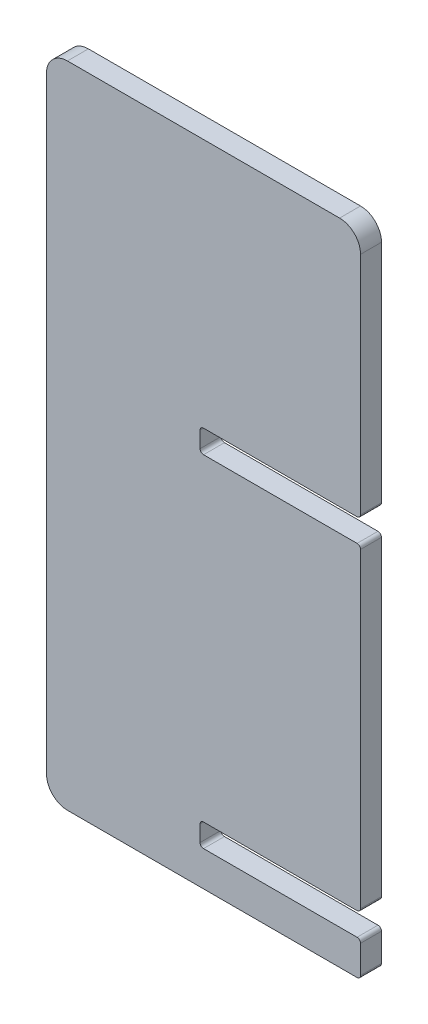
ISO-10303-21;
HEADER;
FILE_DESCRIPTION(('STEP AP214'),'2;1');
FILE_NAME('part.step','',(''),(''),'','','');
FILE_SCHEMA(('AUTOMOTIVE_DESIGN { 1 0 10303 214 1 1 1 1 }'));
ENDSEC;
DATA;
#1=APPLICATION_CONTEXT('core data for automotive mechanical design processes');
#2=APPLICATION_PROTOCOL_DEFINITION('international standard','automotive_design',2000,#1);
#3=PRODUCT_CONTEXT('',#1,'mechanical');
#4=PRODUCT('Part','Part','',(#3));
#5=PRODUCT_RELATED_PRODUCT_CATEGORY('part','',(#4));
#6=PRODUCT_DEFINITION_FORMATION('','',#4);
#7=PRODUCT_DEFINITION_CONTEXT('part definition',#1,'design');
#8=PRODUCT_DEFINITION('design','',#6,#7);
#9=PRODUCT_DEFINITION_SHAPE('','',#8);
#10=(LENGTH_UNIT() NAMED_UNIT(*) SI_UNIT(.MILLI.,.METRE.));
#11=(NAMED_UNIT(*) PLANE_ANGLE_UNIT() SI_UNIT($,.RADIAN.));
#12=(NAMED_UNIT(*) SI_UNIT($,.STERADIAN.) SOLID_ANGLE_UNIT());
#13=UNCERTAINTY_MEASURE_WITH_UNIT(LENGTH_MEASURE(1.E-05),#10,'distance_accuracy_value','');
#14=(GEOMETRIC_REPRESENTATION_CONTEXT(3) GLOBAL_UNCERTAINTY_ASSIGNED_CONTEXT((#13)) GLOBAL_UNIT_ASSIGNED_CONTEXT((#10,
#11,#12)) REPRESENTATION_CONTEXT('',''));
#15=CARTESIAN_POINT('',(0.,0.,0.));
#16=DIRECTION('',(0.,0.,1.));
#17=DIRECTION('',(1.,0.,0.));
#18=AXIS2_PLACEMENT_3D('',#15,#16,#17);
#19=CARTESIAN_POINT('',(22.5,45.,3.));
#20=DIRECTION('',(1.,0.,0.));
#21=DIRECTION('',(0.,1.,0.));
#22=AXIS2_PLACEMENT_3D('',#19,#20,#21);
#23=PLANE('',#22);
#24=DIRECTION('',(0.,-1.,0.));
#25=VECTOR('',#24,1.);
#26=CARTESIAN_POINT('',(22.5,45.,0.));
#27=LINE('',#26,#25);
#28=CARTESIAN_POINT('',(22.5,5.37945189583317,0.));
#29=VERTEX_POINT('',#28);
#30=CARTESIAN_POINT('',(22.5,-39.2,0.));
#31=VERTEX_POINT('',#30);
#32=EDGE_CURVE('E230',#29,#31,#27,.T.);
#33=ORIENTED_EDGE('',*,*,#32,.F.);
#34=DIRECTION('',(0.,0.,1.));
#35=VECTOR('',#34,1.);
#36=CARTESIAN_POINT('',(22.5,5.37945189583315,3.));
#37=LINE('',#36,#35);
#38=CARTESIAN_POINT('',(22.5,5.37945189583317,3.));
#39=VERTEX_POINT('',#38);
#40=EDGE_CURVE('E281',#29,#39,#37,.T.);
#41=ORIENTED_EDGE('',*,*,#40,.T.);
#42=DIRECTION('',(0.,-1.,0.));
#43=VECTOR('',#42,1.);
#44=CARTESIAN_POINT('',(22.5,45.,3.));
#45=LINE('',#44,#43);
#46=CARTESIAN_POINT('',(22.5,-39.2,3.));
#47=VERTEX_POINT('',#46);
#48=EDGE_CURVE('E382',#39,#47,#45,.T.);
#49=ORIENTED_EDGE('',*,*,#48,.T.);
#50=DIRECTION('',(0.,0.,1.));
#51=VECTOR('',#50,1.);
#52=CARTESIAN_POINT('',(22.5,-39.2,0.));
#53=LINE('',#52,#51);
#54=EDGE_CURVE('E279',#47,#31,#53,.F.);
#55=ORIENTED_EDGE('',*,*,#54,.T.);
#56=EDGE_LOOP('',(#33,#41,#49,#55));
#57=FACE_BOUND('',#56,.T.);
#58=ADVANCED_FACE('F37',(#57),#23,.T.);
#59=CARTESIAN_POINT('',(22.5,42.,3.));
#60=VERTEX_POINT('',#59);
#61=CARTESIAN_POINT('',(22.5,9.67945189583316,3.));
#62=VERTEX_POINT('',#61);
#63=EDGE_CURVE('E380',#60,#62,#45,.T.);
#64=ORIENTED_EDGE('',*,*,#63,.T.);
#65=DIRECTION('',(0.,0.,1.));
#66=VECTOR('',#65,1.);
#67=CARTESIAN_POINT('',(22.5,9.67945189583315,0.));
#68=LINE('',#67,#66);
#69=CARTESIAN_POINT('',(22.5,9.67945189583316,0.));
#70=VERTEX_POINT('',#69);
#71=EDGE_CURVE('E294',#62,#70,#68,.F.);
#72=ORIENTED_EDGE('',*,*,#71,.T.);
#73=CARTESIAN_POINT('',(22.5,42.,0.));
#74=VERTEX_POINT('',#73);
#75=EDGE_CURVE('E225',#74,#70,#27,.T.);
#76=ORIENTED_EDGE('',*,*,#75,.F.);
#77=DIRECTION('',(0.,0.,-1.));
#78=VECTOR('',#77,1.);
#79=CARTESIAN_POINT('',(22.5,42.,3.));
#80=LINE('',#79,#78);
#81=EDGE_CURVE('E251',#74,#60,#80,.F.);
#82=ORIENTED_EDGE('',*,*,#81,.T.);
#83=EDGE_LOOP('',(#64,#72,#76,#82));
#84=FACE_BOUND('',#83,.T.);
#85=ADVANCED_FACE('F426',(#84),#23,.T.);
#86=CARTESIAN_POINT('',(-22.5,45.,3.));
#87=DIRECTION('',(0.,1.,0.));
#88=DIRECTION('',(0.,0.,1.));
#89=AXIS2_PLACEMENT_3D('',#86,#87,#88);
#90=PLANE('',#89);
#91=DIRECTION('',(1.,0.,0.));
#92=VECTOR('',#91,1.);
#93=CARTESIAN_POINT('',(-22.5,45.,3.));
#94=LINE('',#93,#92);
#95=CARTESIAN_POINT('',(-19.5,45.,3.));
#96=VERTEX_POINT('',#95);
#97=CARTESIAN_POINT('',(19.5,45.,3.));
#98=VERTEX_POINT('',#97);
#99=EDGE_CURVE('E227',#96,#98,#94,.T.);
#100=ORIENTED_EDGE('',*,*,#99,.T.);
#101=DIRECTION('',(0.,0.,-1.));
#102=VECTOR('',#101,1.);
#103=CARTESIAN_POINT('',(19.5,45.,3.));
#104=LINE('',#103,#102);
#105=CARTESIAN_POINT('',(19.5,45.,0.));
#106=VERTEX_POINT('',#105);
#107=EDGE_CURVE('E248',#98,#106,#104,.T.);
#108=ORIENTED_EDGE('',*,*,#107,.T.);
#109=DIRECTION('',(1.,0.,0.));
#110=VECTOR('',#109,1.);
#111=CARTESIAN_POINT('',(-22.5,45.,0.));
#112=LINE('',#111,#110);
#113=CARTESIAN_POINT('',(-19.5,45.,0.));
#114=VERTEX_POINT('',#113);
#115=EDGE_CURVE('E374',#114,#106,#112,.T.);
#116=ORIENTED_EDGE('',*,*,#115,.F.);
#117=DIRECTION('',(0.,0.,-1.));
#118=VECTOR('',#117,1.);
#119=CARTESIAN_POINT('',(-19.5,45.,3.));
#120=LINE('',#119,#118);
#121=EDGE_CURVE('E246',#114,#96,#120,.F.);
#122=ORIENTED_EDGE('',*,*,#121,.T.);
#123=EDGE_LOOP('',(#100,#108,#116,#122));
#124=FACE_BOUND('',#123,.T.);
#125=ADVANCED_FACE('F417',(#124),#90,.T.);
#126=CARTESIAN_POINT('',(-22.5,45.,3.));
#127=DIRECTION('',(1.,0.,0.));
#128=DIRECTION('',(0.,1.,0.));
#129=AXIS2_PLACEMENT_3D('',#126,#127,#128);
#130=PLANE('',#129);
#131=DIRECTION('',(0.,-1.,0.));
#132=VECTOR('',#131,1.);
#133=CARTESIAN_POINT('',(-22.5,45.,0.));
#134=LINE('',#133,#132);
#135=CARTESIAN_POINT('',(-22.5,42.,0.));
#136=VERTEX_POINT('',#135);
#137=CARTESIAN_POINT('',(-22.5,-45.,0.));
#138=VERTEX_POINT('',#137);
#139=EDGE_CURVE('E224',#136,#138,#134,.T.);
#140=ORIENTED_EDGE('',*,*,#139,.T.);
#141=DIRECTION('',(0.,0.,-1.));
#142=VECTOR('',#141,1.);
#143=CARTESIAN_POINT('',(-22.5,-45.,3.));
#144=LINE('',#143,#142);
#145=CARTESIAN_POINT('',(-22.5,-45.,3.));
#146=VERTEX_POINT('',#145);
#147=EDGE_CURVE('E202',#138,#146,#144,.F.);
#148=ORIENTED_EDGE('',*,*,#147,.T.);
#149=DIRECTION('',(0.,-1.,0.));
#150=VECTOR('',#149,1.);
#151=CARTESIAN_POINT('',(-22.5,45.,3.));
#152=LINE('',#151,#150);
#153=CARTESIAN_POINT('',(-22.5,42.,3.));
#154=VERTEX_POINT('',#153);
#155=EDGE_CURVE('E219',#154,#146,#152,.T.);
#156=ORIENTED_EDGE('',*,*,#155,.F.);
#157=DIRECTION('',(0.,0.,-1.));
#158=VECTOR('',#157,1.);
#159=CARTESIAN_POINT('',(-22.5,42.,0.));
#160=LINE('',#159,#158);
#161=EDGE_CURVE('E207',#154,#136,#160,.T.);
#162=ORIENTED_EDGE('',*,*,#161,.T.);
#163=EDGE_LOOP('',(#140,#148,#156,#162));
#164=FACE_BOUND('',#163,.T.);
#165=ADVANCED_FACE('F412',(#164),#130,.F.);
#166=CARTESIAN_POINT('',(-22.5,-48.,3.));
#167=DIRECTION('',(0.,1.,0.));
#168=DIRECTION('',(0.,0.,1.));
#169=AXIS2_PLACEMENT_3D('',#166,#167,#168);
#170=PLANE('',#169);
#171=DIRECTION('',(1.,0.,0.));
#172=VECTOR('',#171,1.);
#173=CARTESIAN_POINT('',(-22.5,-48.,0.));
#174=LINE('',#173,#172);
#175=CARTESIAN_POINT('',(-19.5,-48.,0.));
#176=VERTEX_POINT('',#175);
#177=CARTESIAN_POINT('',(22.,-48.,0.));
#178=VERTEX_POINT('',#177);
#179=EDGE_CURVE('E214',#176,#178,#174,.T.);
#180=ORIENTED_EDGE('',*,*,#179,.T.);
#181=DIRECTION('',(0.,0.,-1.));
#182=VECTOR('',#181,1.);
#183=CARTESIAN_POINT('',(22.,-48.,3.));
#184=LINE('',#183,#182);
#185=CARTESIAN_POINT('',(22.,-48.,3.));
#186=VERTEX_POINT('',#185);
#187=EDGE_CURVE('E268',#178,#186,#184,.F.);
#188=ORIENTED_EDGE('',*,*,#187,.T.);
#189=DIRECTION('',(1.,0.,0.));
#190=VECTOR('',#189,1.);
#191=CARTESIAN_POINT('',(-22.5,-48.,3.));
#192=LINE('',#191,#190);
#193=CARTESIAN_POINT('',(-19.5,-48.,3.));
#194=VERTEX_POINT('',#193);
#195=EDGE_CURVE('E217',#194,#186,#192,.T.);
#196=ORIENTED_EDGE('',*,*,#195,.F.);
#197=DIRECTION('',(0.,0.,-1.));
#198=VECTOR('',#197,1.);
#199=CARTESIAN_POINT('',(-19.5,-48.,3.));
#200=LINE('',#199,#198);
#201=EDGE_CURVE('E201',#194,#176,#200,.T.);
#202=ORIENTED_EDGE('',*,*,#201,.T.);
#203=EDGE_LOOP('',(#180,#188,#196,#202));
#204=FACE_BOUND('',#203,.T.);
#205=ADVANCED_FACE('F213',(#204),#170,.F.);
#206=CARTESIAN_POINT('',(22.5,-43.5,3.));
#207=VERTEX_POINT('',#206);
#208=CARTESIAN_POINT('',(22.5,-47.5,3.));
#209=VERTEX_POINT('',#208);
#210=EDGE_CURVE('E379',#207,#209,#45,.T.);
#211=ORIENTED_EDGE('',*,*,#210,.T.);
#212=DIRECTION('',(0.,0.,-1.));
#213=VECTOR('',#212,1.);
#214=CARTESIAN_POINT('',(22.5,-47.5,0.));
#215=LINE('',#214,#213);
#216=CARTESIAN_POINT('',(22.5,-47.5,0.));
#217=VERTEX_POINT('',#216);
#218=EDGE_CURVE('E256',#209,#217,#215,.T.);
#219=ORIENTED_EDGE('',*,*,#218,.T.);
#220=CARTESIAN_POINT('',(22.5,-43.5,0.));
#221=VERTEX_POINT('',#220);
#222=EDGE_CURVE('E232',#221,#217,#27,.T.);
#223=ORIENTED_EDGE('',*,*,#222,.F.);
#224=DIRECTION('',(0.,0.,1.));
#225=VECTOR('',#224,1.);
#226=CARTESIAN_POINT('',(22.5,-43.5,3.));
#227=LINE('',#226,#225);
#228=EDGE_CURVE('E253',#221,#207,#227,.T.);
#229=ORIENTED_EDGE('',*,*,#228,.T.);
#230=EDGE_LOOP('',(#211,#219,#223,#229));
#231=FACE_BOUND('',#230,.T.);
#232=ADVANCED_FACE('F402',(#231),#23,.T.);
#233=CARTESIAN_POINT('',(0.,0.,3.));
#234=DIRECTION('',(0.,0.,-1.));
#235=DIRECTION('',(-1.,0.,0.));
#236=AXIS2_PLACEMENT_3D('',#233,#234,#235);
#237=PLANE('',#236);
#238=ORIENTED_EDGE('',*,*,#195,.T.);
#239=CARTESIAN_POINT('',(22.,-47.5,3.));
#240=DIRECTION('',(0.,0.,-1.));
#241=DIRECTION('',(-1.,0.,0.));
#242=AXIS2_PLACEMENT_3D('',#239,#240,#241);
#243=CIRCLE('',#242,0.5);
#244=EDGE_CURVE('E277',#186,#209,#243,.F.);
#245=ORIENTED_EDGE('',*,*,#244,.T.);
#246=ORIENTED_EDGE('',*,*,#210,.F.);
#247=CARTESIAN_POINT('',(22.,-43.5,3.));
#248=DIRECTION('',(0.,0.,-1.));
#249=DIRECTION('',(-1.,0.,0.));
#250=AXIS2_PLACEMENT_3D('',#247,#248,#249);
#251=CIRCLE('',#250,0.5);
#252=CARTESIAN_POINT('',(22.,-43.,3.));
#253=VERTEX_POINT('',#252);
#254=EDGE_CURVE('E272',#207,#253,#251,.F.);
#255=ORIENTED_EDGE('',*,*,#254,.T.);
#256=DIRECTION('',(1.,0.,0.));
#257=VECTOR('',#256,1.);
#258=CARTESIAN_POINT('',(22.5,-43.,3.));
#259=LINE('',#258,#257);
#260=CARTESIAN_POINT('',(0.,-43.,3.));
#261=VERTEX_POINT('',#260);
#262=EDGE_CURVE('E357',#261,#253,#259,.T.);
#263=ORIENTED_EDGE('',*,*,#262,.F.);
#264=CARTESIAN_POINT('',(0.,-42.5,3.));
#265=DIRECTION('',(0.,0.,-1.));
#266=DIRECTION('',(-1.,0.,0.));
#267=AXIS2_PLACEMENT_3D('',#264,#265,#266);
#268=CIRCLE('',#267,0.5);
#269=CARTESIAN_POINT('',(-0.500000000000004,-42.5,3.));
#270=VERTEX_POINT('',#269);
#271=EDGE_CURVE('E323',#261,#270,#268,.T.);
#272=ORIENTED_EDGE('',*,*,#271,.T.);
#273=DIRECTION('',(0.,-1.,0.));
#274=VECTOR('',#273,1.);
#275=CARTESIAN_POINT('',(-0.500000000000004,-39.7,3.));
#276=LINE('',#275,#274);
#277=CARTESIAN_POINT('',(-0.500000000000004,-40.2,3.));
#278=VERTEX_POINT('',#277);
#279=EDGE_CURVE('E332',#278,#270,#276,.T.);
#280=ORIENTED_EDGE('',*,*,#279,.F.);
#281=CARTESIAN_POINT('',(0.,-40.2,3.));
#282=DIRECTION('',(0.,0.,-1.));
#283=DIRECTION('',(-1.,0.,0.));
#284=AXIS2_PLACEMENT_3D('',#281,#282,#283);
#285=CIRCLE('',#284,0.5);
#286=CARTESIAN_POINT('',(0.,-39.7,3.));
#287=VERTEX_POINT('',#286);
#288=EDGE_CURVE('E45',#278,#287,#285,.T.);
#289=ORIENTED_EDGE('',*,*,#288,.T.);
#290=DIRECTION('',(-1.,0.,0.));
#291=VECTOR('',#290,1.);
#292=CARTESIAN_POINT('',(22.5,-39.7,3.));
#293=LINE('',#292,#291);
#294=CARTESIAN_POINT('',(22.,-39.7,3.));
#295=VERTEX_POINT('',#294);
#296=EDGE_CURVE('E330',#295,#287,#293,.T.);
#297=ORIENTED_EDGE('',*,*,#296,.F.);
#298=CARTESIAN_POINT('',(22.,-39.2,3.));
#299=DIRECTION('',(0.,0.,-1.));
#300=DIRECTION('',(-1.,0.,0.));
#301=AXIS2_PLACEMENT_3D('',#298,#299,#300);
#302=CIRCLE('',#301,0.5);
#303=EDGE_CURVE('E270',#295,#47,#302,.F.);
#304=ORIENTED_EDGE('',*,*,#303,.T.);
#305=ORIENTED_EDGE('',*,*,#48,.F.);
#306=CARTESIAN_POINT('',(22.,5.37945189583315,3.));
#307=DIRECTION('',(0.,0.,-1.));
#308=DIRECTION('',(-1.,0.,0.));
#309=AXIS2_PLACEMENT_3D('',#306,#307,#308);
#310=CIRCLE('',#309,0.5);
#311=CARTESIAN_POINT('',(22.,5.87945189583315,3.));
#312=VERTEX_POINT('',#311);
#313=EDGE_CURVE('E275',#39,#312,#310,.F.);
#314=ORIENTED_EDGE('',*,*,#313,.T.);
#315=DIRECTION('',(1.,0.,0.));
#316=VECTOR('',#315,1.);
#317=CARTESIAN_POINT('',(22.5,5.87945189583315,3.));
#318=LINE('',#317,#316);
#319=CARTESIAN_POINT('',(0.,5.87945189583315,3.));
#320=VERTEX_POINT('',#319);
#321=EDGE_CURVE('E360',#320,#312,#318,.T.);
#322=ORIENTED_EDGE('',*,*,#321,.F.);
#323=CARTESIAN_POINT('',(0.,6.37945189583315,3.));
#324=DIRECTION('',(0.,0.,-1.));
#325=DIRECTION('',(-1.,0.,0.));
#326=AXIS2_PLACEMENT_3D('',#323,#324,#325);
#327=CIRCLE('',#326,0.5);
#328=CARTESIAN_POINT('',(-0.500000000000004,6.37945189583315,3.));
#329=VERTEX_POINT('',#328);
#330=EDGE_CURVE('E319',#320,#329,#327,.T.);
#331=ORIENTED_EDGE('',*,*,#330,.T.);
#332=DIRECTION('',(0.,-1.,0.));
#333=VECTOR('',#332,1.);
#334=CARTESIAN_POINT('',(-0.500000000000004,9.17945189583315,3.));
#335=LINE('',#334,#333);
#336=CARTESIAN_POINT('',(-0.500000000000004,8.67945189583315,3.));
#337=VERTEX_POINT('',#336);
#338=EDGE_CURVE('E364',#337,#329,#335,.T.);
#339=ORIENTED_EDGE('',*,*,#338,.F.);
#340=CARTESIAN_POINT('',(0.,8.67945189583315,3.));
#341=DIRECTION('',(0.,0.,-1.));
#342=DIRECTION('',(-1.,0.,0.));
#343=AXIS2_PLACEMENT_3D('',#340,#341,#342);
#344=CIRCLE('',#343,0.5);
#345=CARTESIAN_POINT('',(0.,9.17945189583315,3.));
#346=VERTEX_POINT('',#345);
#347=EDGE_CURVE('E58',#337,#346,#344,.T.);
#348=ORIENTED_EDGE('',*,*,#347,.T.);
#349=DIRECTION('',(-1.,0.,0.));
#350=VECTOR('',#349,1.);
#351=CARTESIAN_POINT('',(22.5,9.17945189583315,3.));
#352=LINE('',#351,#350);
#353=CARTESIAN_POINT('',(22.,9.17945189583315,3.));
#354=VERTEX_POINT('',#353);
#355=EDGE_CURVE('E355',#354,#346,#352,.T.);
#356=ORIENTED_EDGE('',*,*,#355,.F.);
#357=CARTESIAN_POINT('',(22.,9.67945189583315,3.));
#358=DIRECTION('',(0.,0.,-1.));
#359=DIRECTION('',(-1.,0.,0.));
#360=AXIS2_PLACEMENT_3D('',#357,#358,#359);
#361=CIRCLE('',#360,0.5);
#362=EDGE_CURVE('E52',#354,#62,#361,.F.);
#363=ORIENTED_EDGE('',*,*,#362,.T.);
#364=ORIENTED_EDGE('',*,*,#63,.F.);
#365=CARTESIAN_POINT('',(19.5,42.,3.));
#366=DIRECTION('',(0.,0.,-1.));
#367=DIRECTION('',(-1.,0.,0.));
#368=AXIS2_PLACEMENT_3D('',#365,#366,#367);
#369=CIRCLE('',#368,3.);
#370=EDGE_CURVE('E242',#60,#98,#369,.F.);
#371=ORIENTED_EDGE('',*,*,#370,.T.);
#372=ORIENTED_EDGE('',*,*,#99,.F.);
#373=CARTESIAN_POINT('',(-19.5,42.,3.));
#374=DIRECTION('',(0.,0.,-1.));
#375=DIRECTION('',(-1.,0.,0.));
#376=AXIS2_PLACEMENT_3D('',#373,#374,#375);
#377=CIRCLE('',#376,3.);
#378=EDGE_CURVE('E240',#96,#154,#377,.F.);
#379=ORIENTED_EDGE('',*,*,#378,.T.);
#380=ORIENTED_EDGE('',*,*,#155,.T.);
#381=CARTESIAN_POINT('',(-19.5,-45.,3.));
#382=DIRECTION('',(0.,0.,-1.));
#383=DIRECTION('',(-1.,0.,0.));
#384=AXIS2_PLACEMENT_3D('',#381,#382,#383);
#385=CIRCLE('',#384,3.);
#386=EDGE_CURVE('E244',#146,#194,#385,.F.);
#387=ORIENTED_EDGE('',*,*,#386,.T.);
#388=EDGE_LOOP('',(#238,#245,#246,#255,#263,#272,#280,#289,#297,#304,#305,#314,#322,#331,#339,
#348,#356,#363,#364,#371,#372,#379,#380,#387));
#389=FACE_BOUND('',#388,.T.);
#390=ADVANCED_FACE('F329',(#389),#237,.F.);
#391=CARTESIAN_POINT('',(0.,0.,0.));
#392=DIRECTION('',(0.,0.,-1.));
#393=DIRECTION('',(-1.,0.,0.));
#394=AXIS2_PLACEMENT_3D('',#391,#392,#393);
#395=PLANE('',#394);
#396=ORIENTED_EDGE('',*,*,#222,.T.);
#397=CARTESIAN_POINT('',(22.,-47.5,0.));
#398=DIRECTION('',(0.,0.,-1.));
#399=DIRECTION('',(-1.,0.,0.));
#400=AXIS2_PLACEMENT_3D('',#397,#398,#399);
#401=CIRCLE('',#400,0.5);
#402=EDGE_CURVE('E223',#217,#178,#401,.T.);
#403=ORIENTED_EDGE('',*,*,#402,.T.);
#404=ORIENTED_EDGE('',*,*,#179,.F.);
#405=CARTESIAN_POINT('',(-19.5,-45.,0.));
#406=DIRECTION('',(0.,0.,-1.));
#407=DIRECTION('',(-1.,0.,0.));
#408=AXIS2_PLACEMENT_3D('',#405,#406,#407);
#409=CIRCLE('',#408,3.);
#410=EDGE_CURVE('E197',#176,#138,#409,.T.);
#411=ORIENTED_EDGE('',*,*,#410,.T.);
#412=ORIENTED_EDGE('',*,*,#139,.F.);
#413=CARTESIAN_POINT('',(-19.5,42.,0.));
#414=DIRECTION('',(0.,0.,-1.));
#415=DIRECTION('',(-1.,0.,0.));
#416=AXIS2_PLACEMENT_3D('',#413,#414,#415);
#417=CIRCLE('',#416,3.);
#418=EDGE_CURVE('E218',#136,#114,#417,.T.);
#419=ORIENTED_EDGE('',*,*,#418,.T.);
#420=ORIENTED_EDGE('',*,*,#115,.T.);
#421=CARTESIAN_POINT('',(19.5,42.,0.));
#422=DIRECTION('',(0.,0.,-1.));
#423=DIRECTION('',(-1.,0.,0.));
#424=AXIS2_PLACEMENT_3D('',#421,#422,#423);
#425=CIRCLE('',#424,3.);
#426=EDGE_CURVE('E208',#106,#74,#425,.T.);
#427=ORIENTED_EDGE('',*,*,#426,.T.);
#428=ORIENTED_EDGE('',*,*,#75,.T.);
#429=CARTESIAN_POINT('',(22.,9.67945189583315,0.));
#430=DIRECTION('',(0.,0.,-1.));
#431=DIRECTION('',(-1.,0.,0.));
#432=AXIS2_PLACEMENT_3D('',#429,#430,#431);
#433=CIRCLE('',#432,0.5);
#434=CARTESIAN_POINT('',(22.,9.17945189583315,0.));
#435=VERTEX_POINT('',#434);
#436=EDGE_CURVE('E263',#70,#435,#433,.T.);
#437=ORIENTED_EDGE('',*,*,#436,.T.);
#438=DIRECTION('',(-1.,0.,0.));
#439=VECTOR('',#438,1.);
#440=CARTESIAN_POINT('',(22.5,9.17945189583315,0.));
#441=LINE('',#440,#439);
#442=CARTESIAN_POINT('',(0.,9.17945189583315,0.));
#443=VERTEX_POINT('',#442);
#444=EDGE_CURVE('E363',#435,#443,#441,.T.);
#445=ORIENTED_EDGE('',*,*,#444,.T.);
#446=CARTESIAN_POINT('',(0.,8.67945189583315,0.));
#447=DIRECTION('',(0.,0.,-1.));
#448=DIRECTION('',(-1.,0.,0.));
#449=AXIS2_PLACEMENT_3D('',#446,#447,#448);
#450=CIRCLE('',#449,0.5);
#451=CARTESIAN_POINT('',(-0.500000000000004,8.67945189583315,0.));
#452=VERTEX_POINT('',#451);
#453=EDGE_CURVE('E317',#443,#452,#450,.F.);
#454=ORIENTED_EDGE('',*,*,#453,.T.);
#455=DIRECTION('',(0.,-1.,0.));
#456=VECTOR('',#455,1.);
#457=CARTESIAN_POINT('',(-0.500000000000004,9.17945189583315,0.));
#458=LINE('',#457,#456);
#459=CARTESIAN_POINT('',(-0.500000000000004,6.37945189583315,0.));
#460=VERTEX_POINT('',#459);
#461=EDGE_CURVE('E370',#452,#460,#458,.T.);
#462=ORIENTED_EDGE('',*,*,#461,.T.);
#463=CARTESIAN_POINT('',(0.,6.37945189583315,0.));
#464=DIRECTION('',(0.,0.,-1.));
#465=DIRECTION('',(-1.,0.,0.));
#466=AXIS2_PLACEMENT_3D('',#463,#464,#465);
#467=CIRCLE('',#466,0.5);
#468=CARTESIAN_POINT('',(0.,5.87945189583315,0.));
#469=VERTEX_POINT('',#468);
#470=EDGE_CURVE('E321',#460,#469,#467,.F.);
#471=ORIENTED_EDGE('',*,*,#470,.T.);
#472=DIRECTION('',(1.,0.,0.));
#473=VECTOR('',#472,1.);
#474=CARTESIAN_POINT('',(22.5,5.87945189583315,0.));
#475=LINE('',#474,#473);
#476=CARTESIAN_POINT('',(22.,5.87945189583315,0.));
#477=VERTEX_POINT('',#476);
#478=EDGE_CURVE('E371',#469,#477,#475,.T.);
#479=ORIENTED_EDGE('',*,*,#478,.T.);
#480=CARTESIAN_POINT('',(22.,5.37945189583315,0.));
#481=DIRECTION('',(0.,0.,-1.));
#482=DIRECTION('',(-1.,0.,0.));
#483=AXIS2_PLACEMENT_3D('',#480,#481,#482);
#484=CIRCLE('',#483,0.5);
#485=EDGE_CURVE('E265',#477,#29,#484,.T.);
#486=ORIENTED_EDGE('',*,*,#485,.T.);
#487=ORIENTED_EDGE('',*,*,#32,.T.);
#488=CARTESIAN_POINT('',(22.,-39.2,0.));
#489=DIRECTION('',(0.,0.,-1.));
#490=DIRECTION('',(-1.,0.,0.));
#491=AXIS2_PLACEMENT_3D('',#488,#489,#490);
#492=CIRCLE('',#491,0.5);
#493=CARTESIAN_POINT('',(22.,-39.7,0.));
#494=VERTEX_POINT('',#493);
#495=EDGE_CURVE('E259',#31,#494,#492,.T.);
#496=ORIENTED_EDGE('',*,*,#495,.T.);
#497=DIRECTION('',(-1.,0.,0.));
#498=VECTOR('',#497,1.);
#499=CARTESIAN_POINT('',(22.5,-39.7,0.));
#500=LINE('',#499,#498);
#501=CARTESIAN_POINT('',(0.,-39.7,0.));
#502=VERTEX_POINT('',#501);
#503=EDGE_CURVE('E348',#494,#502,#500,.T.);
#504=ORIENTED_EDGE('',*,*,#503,.T.);
#505=CARTESIAN_POINT('',(0.,-40.2,0.));
#506=DIRECTION('',(0.,0.,-1.));
#507=DIRECTION('',(-1.,0.,0.));
#508=AXIS2_PLACEMENT_3D('',#505,#506,#507);
#509=CIRCLE('',#508,0.5);
#510=CARTESIAN_POINT('',(-0.500000000000004,-40.2,0.));
#511=VERTEX_POINT('',#510);
#512=EDGE_CURVE('E11',#502,#511,#509,.F.);
#513=ORIENTED_EDGE('',*,*,#512,.T.);
#514=DIRECTION('',(0.,-1.,0.));
#515=VECTOR('',#514,1.);
#516=CARTESIAN_POINT('',(-0.500000000000004,-39.7,0.));
#517=LINE('',#516,#515);
#518=CARTESIAN_POINT('',(-0.500000000000004,-42.5,0.));
#519=VERTEX_POINT('',#518);
#520=EDGE_CURVE('E346',#511,#519,#517,.T.);
#521=ORIENTED_EDGE('',*,*,#520,.T.);
#522=CARTESIAN_POINT('',(0.,-42.5,0.));
#523=DIRECTION('',(0.,0.,-1.));
#524=DIRECTION('',(-1.,0.,0.));
#525=AXIS2_PLACEMENT_3D('',#522,#523,#524);
#526=CIRCLE('',#525,0.5);
#527=CARTESIAN_POINT('',(0.,-43.,0.));
#528=VERTEX_POINT('',#527);
#529=EDGE_CURVE('E325',#519,#528,#526,.F.);
#530=ORIENTED_EDGE('',*,*,#529,.T.);
#531=DIRECTION('',(1.,0.,0.));
#532=VECTOR('',#531,1.);
#533=CARTESIAN_POINT('',(22.5,-43.,0.));
#534=LINE('',#533,#532);
#535=CARTESIAN_POINT('',(22.,-43.,0.));
#536=VERTEX_POINT('',#535);
#537=EDGE_CURVE('E352',#528,#536,#534,.T.);
#538=ORIENTED_EDGE('',*,*,#537,.T.);
#539=CARTESIAN_POINT('',(22.,-43.5,0.));
#540=DIRECTION('',(0.,0.,-1.));
#541=DIRECTION('',(-1.,0.,0.));
#542=AXIS2_PLACEMENT_3D('',#539,#540,#541);
#543=CIRCLE('',#542,0.5);
#544=EDGE_CURVE('E261',#536,#221,#543,.T.);
#545=ORIENTED_EDGE('',*,*,#544,.T.);
#546=EDGE_LOOP('',(#396,#403,#404,#411,#412,#419,#420,#427,#428,#437,#445,#454,#462,#471,#479,
#486,#487,#496,#504,#513,#521,#530,#538,#545));
#547=FACE_BOUND('',#546,.T.);
#548=ADVANCED_FACE('F222',(#547),#395,.T.);
#549=CARTESIAN_POINT('',(22.5,9.17945189583315,-23.2355331335435));
#550=DIRECTION('',(0.,1.,0.));
#551=DIRECTION('',(-1.,0.,0.));
#552=AXIS2_PLACEMENT_3D('',#549,#550,#551);
#553=PLANE('',#552);
#554=ORIENTED_EDGE('',*,*,#444,.F.);
#555=DIRECTION('',(0.,0.,1.));
#556=VECTOR('',#555,1.);
#557=CARTESIAN_POINT('',(22.,9.17945189583315,3.));
#558=LINE('',#557,#556);
#559=EDGE_CURVE('E291',#435,#354,#558,.T.);
#560=ORIENTED_EDGE('',*,*,#559,.T.);
#561=ORIENTED_EDGE('',*,*,#355,.T.);
#562=DIRECTION('',(0.,0.,1.));
#563=VECTOR('',#562,1.);
#564=CARTESIAN_POINT('',(0.,9.17945189583315,0.));
#565=LINE('',#564,#563);
#566=EDGE_CURVE('E289',#346,#443,#565,.F.);
#567=ORIENTED_EDGE('',*,*,#566,.T.);
#568=EDGE_LOOP('',(#554,#560,#561,#567));
#569=FACE_BOUND('',#568,.T.);
#570=ADVANCED_FACE('F434',(#569),#553,.F.);
#571=CARTESIAN_POINT('',(-0.500000000000004,9.17945189583315,-23.2355331335435));
#572=DIRECTION('',(-1.,0.,0.));
#573=DIRECTION('',(0.,-1.,0.));
#574=AXIS2_PLACEMENT_3D('',#571,#572,#573);
#575=PLANE('',#574);
#576=ORIENTED_EDGE('',*,*,#461,.F.);
#577=DIRECTION('',(0.,0.,1.));
#578=VECTOR('',#577,1.);
#579=CARTESIAN_POINT('',(-0.500000000000004,8.67945189583315,3.));
#580=LINE('',#579,#578);
#581=EDGE_CURVE('E298',#452,#337,#580,.T.);
#582=ORIENTED_EDGE('',*,*,#581,.T.);
#583=ORIENTED_EDGE('',*,*,#338,.T.);
#584=DIRECTION('',(0.,0.,1.));
#585=VECTOR('',#584,1.);
#586=CARTESIAN_POINT('',(-0.500000000000004,6.37945189583315,0.));
#587=LINE('',#586,#585);
#588=EDGE_CURVE('E296',#329,#460,#587,.F.);
#589=ORIENTED_EDGE('',*,*,#588,.T.);
#590=EDGE_LOOP('',(#576,#582,#583,#589));
#591=FACE_BOUND('',#590,.T.);
#592=ADVANCED_FACE('F442',(#591),#575,.F.);
#593=CARTESIAN_POINT('',(22.5,5.87945189583315,-23.2355331335435));
#594=DIRECTION('',(0.,-1.,0.));
#595=DIRECTION('',(0.,0.,-1.));
#596=AXIS2_PLACEMENT_3D('',#593,#594,#595);
#597=PLANE('',#596);
#598=ORIENTED_EDGE('',*,*,#321,.T.);
#599=DIRECTION('',(0.,0.,1.));
#600=VECTOR('',#599,1.);
#601=CARTESIAN_POINT('',(22.,5.87945189583315,0.));
#602=LINE('',#601,#600);
#603=EDGE_CURVE('E287',#312,#477,#602,.F.);
#604=ORIENTED_EDGE('',*,*,#603,.T.);
#605=ORIENTED_EDGE('',*,*,#478,.F.);
#606=DIRECTION('',(0.,0.,1.));
#607=VECTOR('',#606,1.);
#608=CARTESIAN_POINT('',(0.,5.87945189583315,3.));
#609=LINE('',#608,#607);
#610=EDGE_CURVE('E284',#469,#320,#609,.T.);
#611=ORIENTED_EDGE('',*,*,#610,.T.);
#612=EDGE_LOOP('',(#598,#604,#605,#611));
#613=FACE_BOUND('',#612,.T.);
#614=ADVANCED_FACE('F449',(#613),#597,.F.);
#615=CARTESIAN_POINT('',(22.5,-39.7,-23.2355331335435));
#616=DIRECTION('',(0.,1.,0.));
#617=DIRECTION('',(0.,0.,1.));
#618=AXIS2_PLACEMENT_3D('',#615,#616,#617);
#619=PLANE('',#618);
#620=ORIENTED_EDGE('',*,*,#296,.T.);
#621=DIRECTION('',(0.,0.,1.));
#622=VECTOR('',#621,1.);
#623=CARTESIAN_POINT('',(0.,-39.7,0.));
#624=LINE('',#623,#622);
#625=EDGE_CURVE('E314',#287,#502,#624,.F.);
#626=ORIENTED_EDGE('',*,*,#625,.T.);
#627=ORIENTED_EDGE('',*,*,#503,.F.);
#628=DIRECTION('',(0.,0.,1.));
#629=VECTOR('',#628,1.);
#630=CARTESIAN_POINT('',(22.,-39.7,3.));
#631=LINE('',#630,#629);
#632=EDGE_CURVE('E311',#494,#295,#631,.T.);
#633=ORIENTED_EDGE('',*,*,#632,.T.);
#634=EDGE_LOOP('',(#620,#626,#627,#633));
#635=FACE_BOUND('',#634,.T.);
#636=ADVANCED_FACE('F337',(#635),#619,.F.);
#637=CARTESIAN_POINT('',(-0.500000000000004,-39.7,-23.2355331335435));
#638=DIRECTION('',(-1.,0.,0.));
#639=DIRECTION('',(0.,-1.,0.));
#640=AXIS2_PLACEMENT_3D('',#637,#638,#639);
#641=PLANE('',#640);
#642=ORIENTED_EDGE('',*,*,#279,.T.);
#643=DIRECTION('',(0.,0.,1.));
#644=VECTOR('',#643,1.);
#645=CARTESIAN_POINT('',(-0.500000000000004,-42.5,0.));
#646=LINE('',#645,#644);
#647=EDGE_CURVE('E309',#270,#519,#646,.F.);
#648=ORIENTED_EDGE('',*,*,#647,.T.);
#649=ORIENTED_EDGE('',*,*,#520,.F.);
#650=DIRECTION('',(0.,0.,1.));
#651=VECTOR('',#650,1.);
#652=CARTESIAN_POINT('',(-0.500000000000004,-40.2,3.));
#653=LINE('',#652,#651);
#654=EDGE_CURVE('E306',#511,#278,#653,.T.);
#655=ORIENTED_EDGE('',*,*,#654,.T.);
#656=EDGE_LOOP('',(#642,#648,#649,#655));
#657=FACE_BOUND('',#656,.T.);
#658=ADVANCED_FACE('F350',(#657),#641,.F.);
#659=CARTESIAN_POINT('',(22.5,-43.,-23.2355331335435));
#660=DIRECTION('',(0.,-1.,0.));
#661=DIRECTION('',(0.,0.,-1.));
#662=AXIS2_PLACEMENT_3D('',#659,#660,#661);
#663=PLANE('',#662);
#664=ORIENTED_EDGE('',*,*,#262,.T.);
#665=DIRECTION('',(0.,0.,1.));
#666=VECTOR('',#665,1.);
#667=CARTESIAN_POINT('',(22.,-43.,0.));
#668=LINE('',#667,#666);
#669=EDGE_CURVE('E304',#253,#536,#668,.F.);
#670=ORIENTED_EDGE('',*,*,#669,.T.);
#671=ORIENTED_EDGE('',*,*,#537,.F.);
#672=DIRECTION('',(0.,0.,1.));
#673=VECTOR('',#672,1.);
#674=CARTESIAN_POINT('',(0.,-43.,3.));
#675=LINE('',#674,#673);
#676=EDGE_CURVE('E301',#528,#261,#675,.T.);
#677=ORIENTED_EDGE('',*,*,#676,.T.);
#678=EDGE_LOOP('',(#664,#670,#671,#677));
#679=FACE_BOUND('',#678,.T.);
#680=ADVANCED_FACE('F492',(#679),#663,.F.);
#681=CARTESIAN_POINT('',(-19.5,-45.,3.));
#682=DIRECTION('',(0.,0.,-1.));
#683=DIRECTION('',(-1.,0.,0.));
#684=AXIS2_PLACEMENT_3D('',#681,#682,#683);
#685=CYLINDRICAL_SURFACE('',#684,3.);
#686=ORIENTED_EDGE('',*,*,#386,.F.);
#687=ORIENTED_EDGE('',*,*,#147,.F.);
#688=ORIENTED_EDGE('',*,*,#410,.F.);
#689=ORIENTED_EDGE('',*,*,#201,.F.);
#690=EDGE_LOOP('',(#686,#687,#688,#689));
#691=FACE_BOUND('',#690,.T.);
#692=ADVANCED_FACE('F200',(#691),#685,.T.);
#693=CARTESIAN_POINT('',(19.5,42.,3.));
#694=DIRECTION('',(0.,0.,-1.));
#695=DIRECTION('',(-1.,0.,0.));
#696=AXIS2_PLACEMENT_3D('',#693,#694,#695);
#697=CYLINDRICAL_SURFACE('',#696,3.);
#698=ORIENTED_EDGE('',*,*,#370,.F.);
#699=ORIENTED_EDGE('',*,*,#81,.F.);
#700=ORIENTED_EDGE('',*,*,#426,.F.);
#701=ORIENTED_EDGE('',*,*,#107,.F.);
#702=EDGE_LOOP('',(#698,#699,#700,#701));
#703=FACE_BOUND('',#702,.T.);
#704=ADVANCED_FACE('F421',(#703),#697,.T.);
#705=CARTESIAN_POINT('',(-19.5,42.,3.));
#706=DIRECTION('',(0.,0.,1.));
#707=DIRECTION('',(1.,0.,0.));
#708=AXIS2_PLACEMENT_3D('',#705,#706,#707);
#709=CYLINDRICAL_SURFACE('',#708,3.);
#710=ORIENTED_EDGE('',*,*,#378,.F.);
#711=ORIENTED_EDGE('',*,*,#121,.F.);
#712=ORIENTED_EDGE('',*,*,#418,.F.);
#713=ORIENTED_EDGE('',*,*,#161,.F.);
#714=EDGE_LOOP('',(#710,#711,#712,#713));
#715=FACE_BOUND('',#714,.T.);
#716=ADVANCED_FACE('F414',(#715),#709,.T.);
#717=CARTESIAN_POINT('',(22.,-47.5,3.));
#718=DIRECTION('',(0.,0.,1.));
#719=DIRECTION('',(1.,0.,0.));
#720=AXIS2_PLACEMENT_3D('',#717,#718,#719);
#721=CYLINDRICAL_SURFACE('',#720,0.5);
#722=ORIENTED_EDGE('',*,*,#244,.F.);
#723=ORIENTED_EDGE('',*,*,#187,.F.);
#724=ORIENTED_EDGE('',*,*,#402,.F.);
#725=ORIENTED_EDGE('',*,*,#218,.F.);
#726=EDGE_LOOP('',(#722,#723,#724,#725));
#727=FACE_BOUND('',#726,.T.);
#728=ADVANCED_FACE('F406',(#727),#721,.T.);
#729=CARTESIAN_POINT('',(22.,5.37945189583315,3.));
#730=DIRECTION('',(0.,0.,-1.));
#731=DIRECTION('',(-1.,0.,0.));
#732=AXIS2_PLACEMENT_3D('',#729,#730,#731);
#733=CYLINDRICAL_SURFACE('',#732,0.5);
#734=ORIENTED_EDGE('',*,*,#485,.F.);
#735=ORIENTED_EDGE('',*,*,#603,.F.);
#736=ORIENTED_EDGE('',*,*,#313,.F.);
#737=ORIENTED_EDGE('',*,*,#40,.F.);
#738=EDGE_LOOP('',(#734,#735,#736,#737));
#739=FACE_BOUND('',#738,.T.);
#740=ADVANCED_FACE('F453',(#739),#733,.T.);
#741=CARTESIAN_POINT('',(22.,9.67945189583315,-23.2355331335435));
#742=DIRECTION('',(0.,0.,-1.));
#743=DIRECTION('',(-1.,0.,0.));
#744=AXIS2_PLACEMENT_3D('',#741,#742,#743);
#745=CYLINDRICAL_SURFACE('',#744,0.5);
#746=ORIENTED_EDGE('',*,*,#436,.F.);
#747=ORIENTED_EDGE('',*,*,#71,.F.);
#748=ORIENTED_EDGE('',*,*,#362,.F.);
#749=ORIENTED_EDGE('',*,*,#559,.F.);
#750=EDGE_LOOP('',(#746,#747,#748,#749));
#751=FACE_BOUND('',#750,.T.);
#752=ADVANCED_FACE('F429',(#751),#745,.T.);
#753=CARTESIAN_POINT('',(0.,8.67945189583315,-23.2355331335435));
#754=DIRECTION('',(0.,0.,-1.));
#755=DIRECTION('',(-1.,0.,0.));
#756=AXIS2_PLACEMENT_3D('',#753,#754,#755);
#757=CYLINDRICAL_SURFACE('',#756,0.5);
#758=ORIENTED_EDGE('',*,*,#453,.F.);
#759=ORIENTED_EDGE('',*,*,#566,.F.);
#760=ORIENTED_EDGE('',*,*,#347,.F.);
#761=ORIENTED_EDGE('',*,*,#581,.F.);
#762=EDGE_LOOP('',(#758,#759,#760,#761));
#763=FACE_BOUND('',#762,.T.);
#764=ADVANCED_FACE('F437',(#763),#757,.F.);
#765=CARTESIAN_POINT('',(0.,6.37945189583315,-23.2355331335435));
#766=DIRECTION('',(0.,0.,-1.));
#767=DIRECTION('',(-1.,0.,0.));
#768=AXIS2_PLACEMENT_3D('',#765,#766,#767);
#769=CYLINDRICAL_SURFACE('',#768,0.5);
#770=ORIENTED_EDGE('',*,*,#470,.F.);
#771=ORIENTED_EDGE('',*,*,#588,.F.);
#772=ORIENTED_EDGE('',*,*,#330,.F.);
#773=ORIENTED_EDGE('',*,*,#610,.F.);
#774=EDGE_LOOP('',(#770,#771,#772,#773));
#775=FACE_BOUND('',#774,.T.);
#776=ADVANCED_FACE('F445',(#775),#769,.F.);
#777=CARTESIAN_POINT('',(22.,-43.5,3.));
#778=DIRECTION('',(0.,0.,-1.));
#779=DIRECTION('',(-1.,0.,0.));
#780=AXIS2_PLACEMENT_3D('',#777,#778,#779);
#781=CYLINDRICAL_SURFACE('',#780,0.5);
#782=ORIENTED_EDGE('',*,*,#544,.F.);
#783=ORIENTED_EDGE('',*,*,#669,.F.);
#784=ORIENTED_EDGE('',*,*,#254,.F.);
#785=ORIENTED_EDGE('',*,*,#228,.F.);
#786=EDGE_LOOP('',(#782,#783,#784,#785));
#787=FACE_BOUND('',#786,.T.);
#788=ADVANCED_FACE('F507',(#787),#781,.T.);
#789=CARTESIAN_POINT('',(0.,-42.5,-23.2355331335435));
#790=DIRECTION('',(0.,0.,-1.));
#791=DIRECTION('',(-1.,0.,0.));
#792=AXIS2_PLACEMENT_3D('',#789,#790,#791);
#793=CYLINDRICAL_SURFACE('',#792,0.5);
#794=ORIENTED_EDGE('',*,*,#529,.F.);
#795=ORIENTED_EDGE('',*,*,#647,.F.);
#796=ORIENTED_EDGE('',*,*,#271,.F.);
#797=ORIENTED_EDGE('',*,*,#676,.F.);
#798=EDGE_LOOP('',(#794,#795,#796,#797));
#799=FACE_BOUND('',#798,.T.);
#800=ADVANCED_FACE('F509',(#799),#793,.F.);
#801=CARTESIAN_POINT('',(0.,-40.2,-23.2355331335435));
#802=DIRECTION('',(0.,0.,-1.));
#803=DIRECTION('',(-1.,0.,0.));
#804=AXIS2_PLACEMENT_3D('',#801,#802,#803);
#805=CYLINDRICAL_SURFACE('',#804,0.5);
#806=ORIENTED_EDGE('',*,*,#512,.F.);
#807=ORIENTED_EDGE('',*,*,#625,.F.);
#808=ORIENTED_EDGE('',*,*,#288,.F.);
#809=ORIENTED_EDGE('',*,*,#654,.F.);
#810=EDGE_LOOP('',(#806,#807,#808,#809));
#811=FACE_BOUND('',#810,.T.);
#812=ADVANCED_FACE('F343',(#811),#805,.F.);
#813=CARTESIAN_POINT('',(22.,-39.2,-23.2355331335435));
#814=DIRECTION('',(0.,0.,-1.));
#815=DIRECTION('',(-1.,0.,0.));
#816=AXIS2_PLACEMENT_3D('',#813,#814,#815);
#817=CYLINDRICAL_SURFACE('',#816,0.5);
#818=ORIENTED_EDGE('',*,*,#495,.F.);
#819=ORIENTED_EDGE('',*,*,#54,.F.);
#820=ORIENTED_EDGE('',*,*,#303,.F.);
#821=ORIENTED_EDGE('',*,*,#632,.F.);
#822=EDGE_LOOP('',(#818,#819,#820,#821));
#823=FACE_BOUND('',#822,.T.);
#824=ADVANCED_FACE('F39',(#823),#817,.T.);
#825=CLOSED_SHELL('',(#58,#85,#125,#165,#205,#232,#390,#548,#570,#592,#614,#636,#658,#680,#692,
#704,#716,#728,#740,#752,#764,#776,#788,#800,#812,#824));
#826=MANIFOLD_SOLID_BREP('B2',#825);
#827=ADVANCED_BREP_SHAPE_REPRESENTATION('',(#18,#826),#14);
#828=SHAPE_DEFINITION_REPRESENTATION(#9,#827);
ENDSEC;
END-ISO-10303-21;
